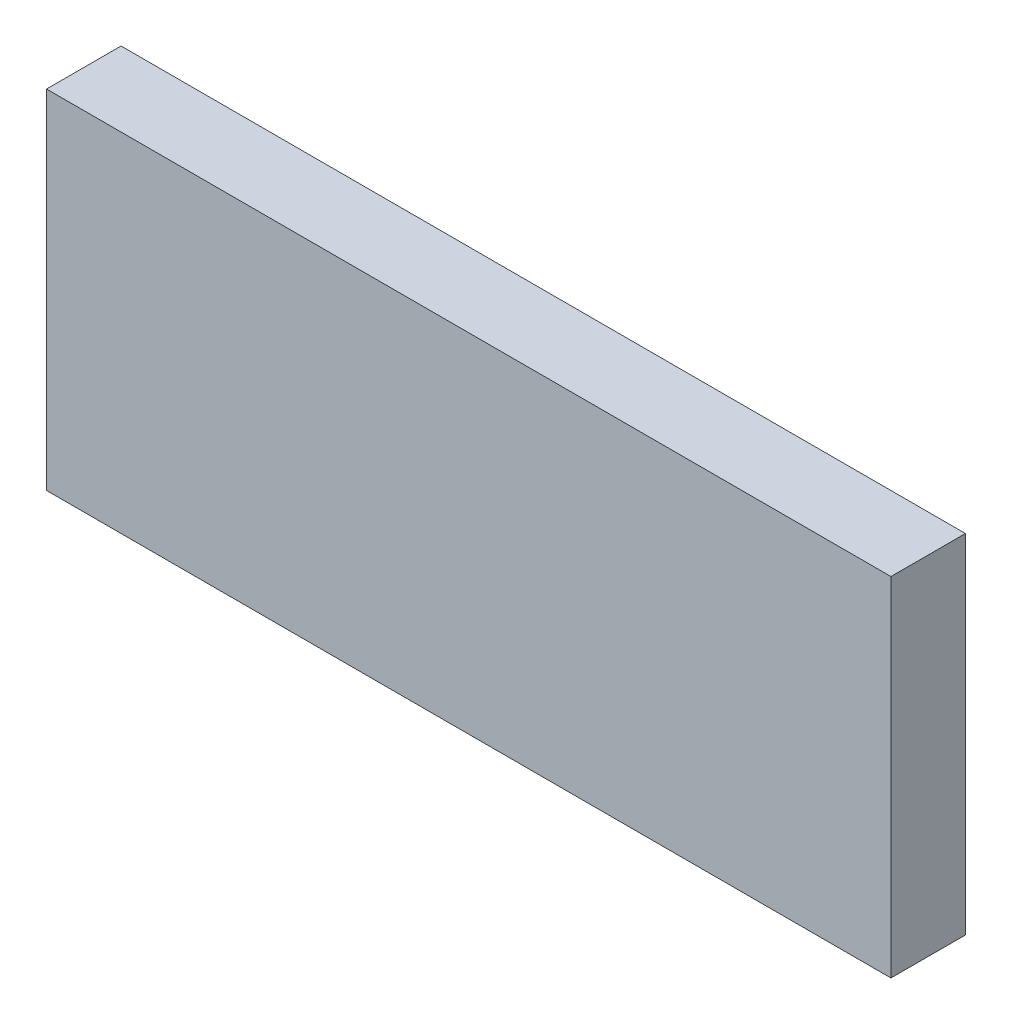
ISO-10303-21;
HEADER;
FILE_DESCRIPTION(('STEP AP214'),'2;1');
FILE_NAME('part.step','',(''),(''),'','','');
FILE_SCHEMA(('AUTOMOTIVE_DESIGN { 1 0 10303 214 1 1 1 1 }'));
ENDSEC;
DATA;
#1=APPLICATION_CONTEXT('core data for automotive mechanical design processes');
#2=APPLICATION_PROTOCOL_DEFINITION('international standard','automotive_design',2000,#1);
#3=PRODUCT_CONTEXT('',#1,'mechanical');
#4=PRODUCT('Part','Part','',(#3));
#5=PRODUCT_RELATED_PRODUCT_CATEGORY('part','',(#4));
#6=PRODUCT_DEFINITION_FORMATION('','',#4);
#7=PRODUCT_DEFINITION_CONTEXT('part definition',#1,'design');
#8=PRODUCT_DEFINITION('design','',#6,#7);
#9=PRODUCT_DEFINITION_SHAPE('','',#8);
#10=(LENGTH_UNIT() NAMED_UNIT(*) SI_UNIT(.MILLI.,.METRE.));
#11=(NAMED_UNIT(*) PLANE_ANGLE_UNIT() SI_UNIT($,.RADIAN.));
#12=(NAMED_UNIT(*) SI_UNIT($,.STERADIAN.) SOLID_ANGLE_UNIT());
#13=UNCERTAINTY_MEASURE_WITH_UNIT(LENGTH_MEASURE(1.E-05),#10,'distance_accuracy_value','');
#14=(GEOMETRIC_REPRESENTATION_CONTEXT(3) GLOBAL_UNCERTAINTY_ASSIGNED_CONTEXT((#13)) GLOBAL_UNIT_ASSIGNED_CONTEXT((#10,
#11,#12)) REPRESENTATION_CONTEXT('',''));
#15=CARTESIAN_POINT('',(0.,0.,0.));
#16=DIRECTION('',(0.,0.,1.));
#17=DIRECTION('',(1.,0.,0.));
#18=AXIS2_PLACEMENT_3D('',#15,#16,#17);
#19=CARTESIAN_POINT('',(0.,0.,19.05));
#20=DIRECTION('',(1.,0.,0.));
#21=DIRECTION('',(0.,1.,0.));
#22=AXIS2_PLACEMENT_3D('',#19,#20,#21);
#23=PLANE('',#22);
#24=DIRECTION('',(0.,-1.,0.));
#25=VECTOR('',#24,1.);
#26=CARTESIAN_POINT('',(0.,0.,0.));
#27=LINE('',#26,#25);
#28=CARTESIAN_POINT('',(0.,88.9,0.));
#29=VERTEX_POINT('',#28);
#30=CARTESIAN_POINT('',(0.,0.,0.));
#31=VERTEX_POINT('',#30);
#32=EDGE_CURVE('E107',#29,#31,#27,.T.);
#33=ORIENTED_EDGE('',*,*,#32,.T.);
#34=DIRECTION('',(0.,0.,-1.));
#35=VECTOR('',#34,1.);
#36=CARTESIAN_POINT('',(0.,0.,19.05));
#37=LINE('',#36,#35);
#38=CARTESIAN_POINT('',(0.,0.,19.05));
#39=VERTEX_POINT('',#38);
#40=EDGE_CURVE('E11',#39,#31,#37,.T.);
#41=ORIENTED_EDGE('',*,*,#40,.F.);
#42=DIRECTION('',(0.,-1.,0.));
#43=VECTOR('',#42,1.);
#44=CARTESIAN_POINT('',(0.,0.,19.05));
#45=LINE('',#44,#43);
#46=CARTESIAN_POINT('',(0.,88.9,19.05));
#47=VERTEX_POINT('',#46);
#48=EDGE_CURVE('E91',#47,#39,#45,.T.);
#49=ORIENTED_EDGE('',*,*,#48,.F.);
#50=DIRECTION('',(0.,0.,-1.));
#51=VECTOR('',#50,1.);
#52=CARTESIAN_POINT('',(0.,88.9,19.05));
#53=LINE('',#52,#51);
#54=EDGE_CURVE('E103',#47,#29,#53,.T.);
#55=ORIENTED_EDGE('',*,*,#54,.T.);
#56=EDGE_LOOP('',(#33,#41,#49,#55));
#57=FACE_BOUND('',#56,.T.);
#58=ADVANCED_FACE('F39',(#57),#23,.F.);
#59=CARTESIAN_POINT('',(0.,0.,19.05));
#60=DIRECTION('',(0.,1.,0.));
#61=DIRECTION('',(0.,0.,1.));
#62=AXIS2_PLACEMENT_3D('',#59,#60,#61);
#63=PLANE('',#62);
#64=DIRECTION('',(1.,0.,0.));
#65=VECTOR('',#64,1.);
#66=CARTESIAN_POINT('',(0.,0.,0.));
#67=LINE('',#66,#65);
#68=CARTESIAN_POINT('',(215.9,0.,0.));
#69=VERTEX_POINT('',#68);
#70=EDGE_CURVE('E96',#31,#69,#67,.T.);
#71=ORIENTED_EDGE('',*,*,#70,.T.);
#72=DIRECTION('',(0.,0.,-1.));
#73=VECTOR('',#72,1.);
#74=CARTESIAN_POINT('',(215.9,0.,19.05));
#75=LINE('',#74,#73);
#76=CARTESIAN_POINT('',(215.9,0.,19.05));
#77=VERTEX_POINT('',#76);
#78=EDGE_CURVE('E48',#77,#69,#75,.T.);
#79=ORIENTED_EDGE('',*,*,#78,.F.);
#80=DIRECTION('',(1.,0.,0.));
#81=VECTOR('',#80,1.);
#82=CARTESIAN_POINT('',(0.,0.,19.05));
#83=LINE('',#82,#81);
#84=EDGE_CURVE('E86',#39,#77,#83,.T.);
#85=ORIENTED_EDGE('',*,*,#84,.F.);
#86=ORIENTED_EDGE('',*,*,#40,.T.);
#87=EDGE_LOOP('',(#71,#79,#85,#86));
#88=FACE_BOUND('',#87,.T.);
#89=ADVANCED_FACE('F95',(#88),#63,.F.);
#90=CARTESIAN_POINT('',(215.9,0.,19.05));
#91=DIRECTION('',(-1.,0.,0.));
#92=DIRECTION('',(0.,-1.,0.));
#93=AXIS2_PLACEMENT_3D('',#90,#91,#92);
#94=PLANE('',#93);
#95=DIRECTION('',(0.,1.,0.));
#96=VECTOR('',#95,1.);
#97=CARTESIAN_POINT('',(215.9,0.,0.));
#98=LINE('',#97,#96);
#99=CARTESIAN_POINT('',(215.9,88.9,0.));
#100=VERTEX_POINT('',#99);
#101=EDGE_CURVE('E73',#69,#100,#98,.T.);
#102=ORIENTED_EDGE('',*,*,#101,.T.);
#103=DIRECTION('',(0.,0.,-1.));
#104=VECTOR('',#103,1.);
#105=CARTESIAN_POINT('',(215.9,88.9,19.05));
#106=LINE('',#105,#104);
#107=CARTESIAN_POINT('',(215.9,88.9,19.05));
#108=VERTEX_POINT('',#107);
#109=EDGE_CURVE('E98',#108,#100,#106,.T.);
#110=ORIENTED_EDGE('',*,*,#109,.F.);
#111=DIRECTION('',(0.,1.,0.));
#112=VECTOR('',#111,1.);
#113=CARTESIAN_POINT('',(215.9,0.,19.05));
#114=LINE('',#113,#112);
#115=EDGE_CURVE('E89',#77,#108,#114,.T.);
#116=ORIENTED_EDGE('',*,*,#115,.F.);
#117=ORIENTED_EDGE('',*,*,#78,.T.);
#118=EDGE_LOOP('',(#102,#110,#116,#117));
#119=FACE_BOUND('',#118,.T.);
#120=ADVANCED_FACE('F99',(#119),#94,.F.);
#121=CARTESIAN_POINT('',(0.,88.9,19.05));
#122=DIRECTION('',(0.,-1.,0.));
#123=DIRECTION('',(0.,0.,-1.));
#124=AXIS2_PLACEMENT_3D('',#121,#122,#123);
#125=PLANE('',#124);
#126=DIRECTION('',(-1.,0.,0.));
#127=VECTOR('',#126,1.);
#128=CARTESIAN_POINT('',(0.,88.9,0.));
#129=LINE('',#128,#127);
#130=EDGE_CURVE('E79',#100,#29,#129,.T.);
#131=ORIENTED_EDGE('',*,*,#130,.T.);
#132=ORIENTED_EDGE('',*,*,#54,.F.);
#133=DIRECTION('',(-1.,0.,0.));
#134=VECTOR('',#133,1.);
#135=CARTESIAN_POINT('',(0.,88.9,19.05));
#136=LINE('',#135,#134);
#137=EDGE_CURVE('E56',#108,#47,#136,.T.);
#138=ORIENTED_EDGE('',*,*,#137,.F.);
#139=ORIENTED_EDGE('',*,*,#109,.T.);
#140=EDGE_LOOP('',(#131,#132,#138,#139));
#141=FACE_BOUND('',#140,.T.);
#142=ADVANCED_FACE('F120',(#141),#125,.F.);
#143=CARTESIAN_POINT('',(0.,0.,19.05));
#144=DIRECTION('',(0.,0.,-1.));
#145=DIRECTION('',(-1.,0.,0.));
#146=AXIS2_PLACEMENT_3D('',#143,#144,#145);
#147=PLANE('',#146);
#148=ORIENTED_EDGE('',*,*,#48,.T.);
#149=ORIENTED_EDGE('',*,*,#84,.T.);
#150=ORIENTED_EDGE('',*,*,#115,.T.);
#151=ORIENTED_EDGE('',*,*,#137,.T.);
#152=EDGE_LOOP('',(#148,#149,#150,#151));
#153=FACE_BOUND('',#152,.T.);
#154=ADVANCED_FACE('F87',(#153),#147,.F.);
#155=CARTESIAN_POINT('',(0.,0.,0.));
#156=DIRECTION('',(0.,0.,-1.));
#157=DIRECTION('',(-1.,0.,0.));
#158=AXIS2_PLACEMENT_3D('',#155,#156,#157);
#159=PLANE('',#158);
#160=ORIENTED_EDGE('',*,*,#32,.F.);
#161=ORIENTED_EDGE('',*,*,#130,.F.);
#162=ORIENTED_EDGE('',*,*,#101,.F.);
#163=ORIENTED_EDGE('',*,*,#70,.F.);
#164=EDGE_LOOP('',(#160,#161,#162,#163));
#165=FACE_BOUND('',#164,.T.);
#166=ADVANCED_FACE('F123',(#165),#159,.T.);
#167=CLOSED_SHELL('',(#58,#89,#120,#142,#154,#166));
#168=MANIFOLD_SOLID_BREP('B2',#167);
#169=ADVANCED_BREP_SHAPE_REPRESENTATION('',(#18,#168),#14);
#170=SHAPE_DEFINITION_REPRESENTATION(#9,#169);
ENDSEC;
END-ISO-10303-21;
